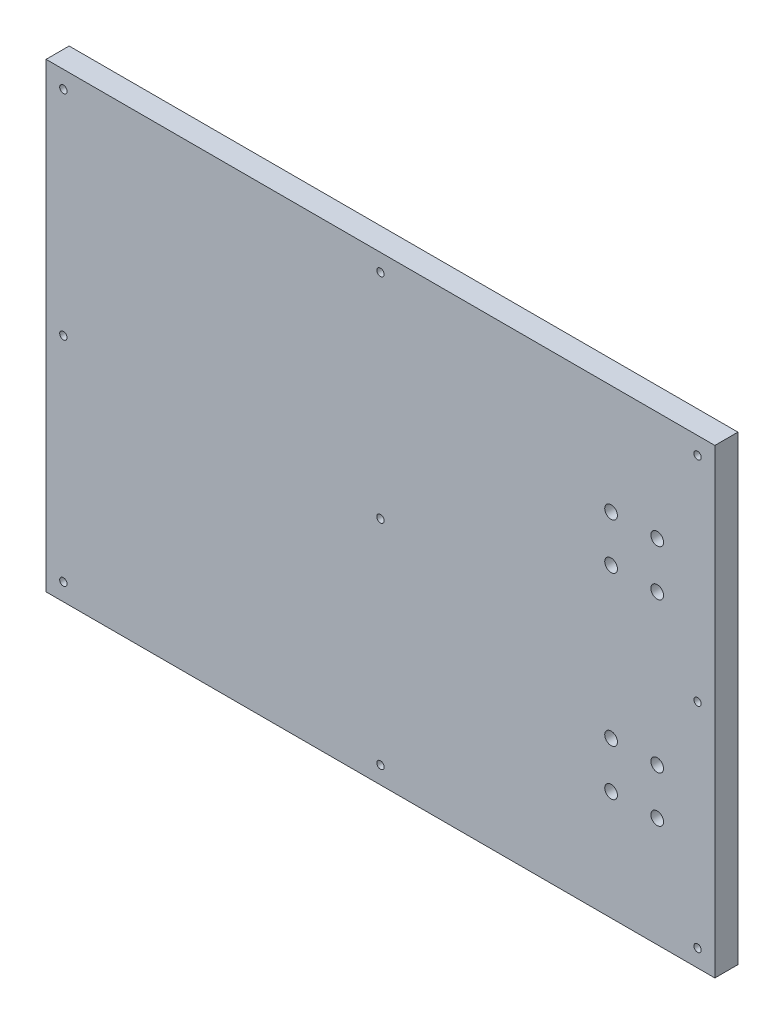
ISO-10303-21;
HEADER;
FILE_DESCRIPTION(('STEP AP214'),'2;1');
FILE_NAME('part.step','',(''),(''),'','','');
FILE_SCHEMA(('AUTOMOTIVE_DESIGN { 1 0 10303 214 1 1 1 1 }'));
ENDSEC;
DATA;
#1=APPLICATION_CONTEXT('core data for automotive mechanical design processes');
#2=APPLICATION_PROTOCOL_DEFINITION('international standard','automotive_design',2000,#1);
#3=PRODUCT_CONTEXT('',#1,'mechanical');
#4=PRODUCT('Part','Part','',(#3));
#5=PRODUCT_RELATED_PRODUCT_CATEGORY('part','',(#4));
#6=PRODUCT_DEFINITION_FORMATION('','',#4);
#7=PRODUCT_DEFINITION_CONTEXT('part definition',#1,'design');
#8=PRODUCT_DEFINITION('design','',#6,#7);
#9=PRODUCT_DEFINITION_SHAPE('','',#8);
#10=(LENGTH_UNIT() NAMED_UNIT(*) SI_UNIT(.MILLI.,.METRE.));
#11=(NAMED_UNIT(*) PLANE_ANGLE_UNIT() SI_UNIT($,.RADIAN.));
#12=(NAMED_UNIT(*) SI_UNIT($,.STERADIAN.) SOLID_ANGLE_UNIT());
#13=UNCERTAINTY_MEASURE_WITH_UNIT(LENGTH_MEASURE(1.E-05),#10,'distance_accuracy_value','');
#14=(GEOMETRIC_REPRESENTATION_CONTEXT(3) GLOBAL_UNCERTAINTY_ASSIGNED_CONTEXT((#13)) GLOBAL_UNIT_ASSIGNED_CONTEXT((#10,
#11,#12)) REPRESENTATION_CONTEXT('',''));
#15=CARTESIAN_POINT('',(0.,0.,0.));
#16=DIRECTION('',(0.,0.,1.));
#17=DIRECTION('',(1.,0.,0.));
#18=AXIS2_PLACEMENT_3D('',#15,#16,#17);
#19=CARTESIAN_POINT('',(0.,0.,10.));
#20=DIRECTION('',(0.,0.,1.));
#21=DIRECTION('',(1.,0.,0.));
#22=AXIS2_PLACEMENT_3D('',#19,#20,#21);
#23=PLANE('',#22);
#24=CARTESIAN_POINT('',(780.197027815795,179.96125611571,10.));
#25=DIRECTION('',(0.,0.,1.));
#26=DIRECTION('',(1.,0.,0.));
#27=AXIS2_PLACEMENT_3D('',#24,#25,#26);
#28=CIRCLE('',#27,1.60000000000005);
#29=CARTESIAN_POINT('',(781.797027815795,179.96125611571,10.));
#30=VERTEX_POINT('',#29);
#31=EDGE_CURVE('E201',#30,#30,#28,.T.);
#32=ORIENTED_EDGE('',*,*,#31,.F.);
#33=EDGE_LOOP('',(#32));
#34=FACE_BOUND('',#33,.T.);
#35=CARTESIAN_POINT('',(780.197027815795,364.961256115709,10.));
#36=DIRECTION('',(0.,0.,1.));
#37=DIRECTION('',(1.,0.,0.));
#38=AXIS2_PLACEMENT_3D('',#35,#36,#37);
#39=CIRCLE('',#38,1.60000000000005);
#40=CARTESIAN_POINT('',(781.797027815795,364.961256115709,10.));
#41=VERTEX_POINT('',#40);
#42=EDGE_CURVE('E189',#41,#41,#39,.T.);
#43=ORIENTED_EDGE('',*,*,#42,.F.);
#44=EDGE_LOOP('',(#43));
#45=FACE_BOUND('',#44,.T.);
#46=CARTESIAN_POINT('',(780.197027815795,272.461256115709,10.));
#47=DIRECTION('',(0.,0.,1.));
#48=DIRECTION('',(1.,0.,0.));
#49=AXIS2_PLACEMENT_3D('',#46,#47,#48);
#50=CIRCLE('',#49,1.60000000000005);
#51=CARTESIAN_POINT('',(781.797027815795,272.461256115709,10.));
#52=VERTEX_POINT('',#51);
#53=EDGE_CURVE('E177',#52,#52,#50,.T.);
#54=ORIENTED_EDGE('',*,*,#53,.F.);
#55=EDGE_LOOP('',(#54));
#56=FACE_BOUND('',#55,.T.);
#57=CARTESIAN_POINT('',(642.697027815795,179.96125611571,10.));
#58=DIRECTION('',(0.,0.,1.));
#59=DIRECTION('',(1.,0.,0.));
#60=AXIS2_PLACEMENT_3D('',#57,#58,#59);
#61=CIRCLE('',#60,1.60000000000005);
#62=CARTESIAN_POINT('',(644.297027815795,179.96125611571,10.));
#63=VERTEX_POINT('',#62);
#64=EDGE_CURVE('E165',#63,#63,#61,.T.);
#65=ORIENTED_EDGE('',*,*,#64,.F.);
#66=EDGE_LOOP('',(#65));
#67=FACE_BOUND('',#66,.T.);
#68=CARTESIAN_POINT('',(762.697027815795,304.96125611571,10.));
#69=DIRECTION('',(0.,0.,1.));
#70=DIRECTION('',(1.,0.,0.));
#71=AXIS2_PLACEMENT_3D('',#68,#69,#70);
#72=CIRCLE('',#71,2.75000000000003);
#73=CARTESIAN_POINT('',(765.447027815795,304.96125611571,10.));
#74=VERTEX_POINT('',#73);
#75=EDGE_CURVE('E153',#74,#74,#72,.T.);
#76=ORIENTED_EDGE('',*,*,#75,.F.);
#77=EDGE_LOOP('',(#76));
#78=FACE_BOUND('',#77,.T.);
#79=CARTESIAN_POINT('',(762.697027815795,324.96125611571,10.));
#80=DIRECTION('',(0.,0.,1.));
#81=DIRECTION('',(1.,0.,0.));
#82=AXIS2_PLACEMENT_3D('',#79,#80,#81);
#83=CIRCLE('',#82,2.75000000000003);
#84=CARTESIAN_POINT('',(765.447027815795,324.96125611571,10.));
#85=VERTEX_POINT('',#84);
#86=EDGE_CURVE('E141',#85,#85,#83,.T.);
#87=ORIENTED_EDGE('',*,*,#86,.F.);
#88=EDGE_LOOP('',(#87));
#89=FACE_BOUND('',#88,.T.);
#90=CARTESIAN_POINT('',(762.697027815795,239.96125611571,10.));
#91=DIRECTION('',(0.,0.,1.));
#92=DIRECTION('',(1.,0.,0.));
#93=AXIS2_PLACEMENT_3D('',#90,#91,#92);
#94=CIRCLE('',#93,2.75000000000003);
#95=CARTESIAN_POINT('',(765.447027815795,239.96125611571,10.));
#96=VERTEX_POINT('',#95);
#97=EDGE_CURVE('E129',#96,#96,#94,.T.);
#98=ORIENTED_EDGE('',*,*,#97,.F.);
#99=EDGE_LOOP('',(#98));
#100=FACE_BOUND('',#99,.T.);
#101=CARTESIAN_POINT('',(762.697027815795,219.96125611571,10.));
#102=DIRECTION('',(0.,0.,1.));
#103=DIRECTION('',(1.,0.,0.));
#104=AXIS2_PLACEMENT_3D('',#101,#102,#103);
#105=CIRCLE('',#104,2.75000000000003);
#106=CARTESIAN_POINT('',(765.447027815795,219.96125611571,10.));
#107=VERTEX_POINT('',#106);
#108=EDGE_CURVE('E117',#107,#107,#105,.T.);
#109=ORIENTED_EDGE('',*,*,#108,.F.);
#110=EDGE_LOOP('',(#109));
#111=FACE_BOUND('',#110,.T.);
#112=DIRECTION('',(0.,1.,0.));
#113=VECTOR('',#112,1.);
#114=CARTESIAN_POINT('',(787.697027815795,172.46125611571,10.));
#115=LINE('',#114,#113);
#116=CARTESIAN_POINT('',(787.697027815795,172.46125611571,10.));
#117=VERTEX_POINT('',#116);
#118=CARTESIAN_POINT('',(787.697027815795,372.461256115709,10.));
#119=VERTEX_POINT('',#118);
#120=EDGE_CURVE('E87',#117,#119,#115,.T.);
#121=ORIENTED_EDGE('',*,*,#120,.T.);
#122=DIRECTION('',(-1.,0.,0.));
#123=VECTOR('',#122,1.);
#124=CARTESIAN_POINT('',(787.697027815795,372.461256115709,10.));
#125=LINE('',#124,#123);
#126=CARTESIAN_POINT('',(497.697027815795,372.46125611571,10.));
#127=VERTEX_POINT('',#126);
#128=EDGE_CURVE('E82',#119,#127,#125,.T.);
#129=ORIENTED_EDGE('',*,*,#128,.T.);
#130=DIRECTION('',(0.,-1.,0.));
#131=VECTOR('',#130,1.);
#132=CARTESIAN_POINT('',(497.697027815795,172.46125611571,10.));
#133=LINE('',#132,#131);
#134=CARTESIAN_POINT('',(497.697027815795,172.46125611571,10.));
#135=VERTEX_POINT('',#134);
#136=EDGE_CURVE('E85',#127,#135,#133,.T.);
#137=ORIENTED_EDGE('',*,*,#136,.T.);
#138=DIRECTION('',(1.,0.,0.));
#139=VECTOR('',#138,1.);
#140=CARTESIAN_POINT('',(497.697027815795,172.46125611571,10.));
#141=LINE('',#140,#139);
#142=EDGE_CURVE('E52',#135,#117,#141,.T.);
#143=ORIENTED_EDGE('',*,*,#142,.T.);
#144=EDGE_LOOP('',(#121,#129,#137,#143));
#145=FACE_BOUND('',#144,.T.);
#146=CARTESIAN_POINT('',(742.697027815795,219.96125611571,10.));
#147=DIRECTION('',(0.,0.,1.));
#148=DIRECTION('',(1.,0.,0.));
#149=AXIS2_PLACEMENT_3D('',#146,#147,#148);
#150=CIRCLE('',#149,2.75000000000003);
#151=CARTESIAN_POINT('',(745.447027815795,219.96125611571,10.));
#152=VERTEX_POINT('',#151);
#153=EDGE_CURVE('E102',#152,#152,#150,.T.);
#154=ORIENTED_EDGE('',*,*,#153,.F.);
#155=EDGE_LOOP('',(#154));
#156=FACE_BOUND('',#155,.T.);
#157=CARTESIAN_POINT('',(742.697027815795,239.96125611571,10.));
#158=DIRECTION('',(0.,0.,1.));
#159=DIRECTION('',(1.,0.,0.));
#160=AXIS2_PLACEMENT_3D('',#157,#158,#159);
#161=CIRCLE('',#160,2.75000000000003);
#162=CARTESIAN_POINT('',(745.447027815795,239.96125611571,10.));
#163=VERTEX_POINT('',#162);
#164=EDGE_CURVE('E123',#163,#163,#161,.T.);
#165=ORIENTED_EDGE('',*,*,#164,.F.);
#166=EDGE_LOOP('',(#165));
#167=FACE_BOUND('',#166,.T.);
#168=CARTESIAN_POINT('',(742.697027815795,324.96125611571,10.));
#169=DIRECTION('',(0.,0.,1.));
#170=DIRECTION('',(1.,0.,0.));
#171=AXIS2_PLACEMENT_3D('',#168,#169,#170);
#172=CIRCLE('',#171,2.75000000000003);
#173=CARTESIAN_POINT('',(745.447027815795,324.96125611571,10.));
#174=VERTEX_POINT('',#173);
#175=EDGE_CURVE('E135',#174,#174,#172,.T.);
#176=ORIENTED_EDGE('',*,*,#175,.F.);
#177=EDGE_LOOP('',(#176));
#178=FACE_BOUND('',#177,.T.);
#179=CARTESIAN_POINT('',(742.697027815795,304.96125611571,10.));
#180=DIRECTION('',(0.,0.,1.));
#181=DIRECTION('',(1.,0.,0.));
#182=AXIS2_PLACEMENT_3D('',#179,#180,#181);
#183=CIRCLE('',#182,2.75000000000003);
#184=CARTESIAN_POINT('',(745.447027815795,304.96125611571,10.));
#185=VERTEX_POINT('',#184);
#186=EDGE_CURVE('E147',#185,#185,#183,.T.);
#187=ORIENTED_EDGE('',*,*,#186,.F.);
#188=EDGE_LOOP('',(#187));
#189=FACE_BOUND('',#188,.T.);
#190=CARTESIAN_POINT('',(642.697027815795,364.96125611571,10.));
#191=DIRECTION('',(0.,0.,1.));
#192=DIRECTION('',(1.,0.,0.));
#193=AXIS2_PLACEMENT_3D('',#190,#191,#192);
#194=CIRCLE('',#193,1.60000000000005);
#195=CARTESIAN_POINT('',(644.297027815795,364.96125611571,10.));
#196=VERTEX_POINT('',#195);
#197=EDGE_CURVE('E159',#196,#196,#194,.T.);
#198=ORIENTED_EDGE('',*,*,#197,.F.);
#199=EDGE_LOOP('',(#198));
#200=FACE_BOUND('',#199,.T.);
#201=CARTESIAN_POINT('',(505.197027815795,272.46125611571,10.));
#202=DIRECTION('',(0.,0.,1.));
#203=DIRECTION('',(1.,0.,0.));
#204=AXIS2_PLACEMENT_3D('',#201,#202,#203);
#205=CIRCLE('',#204,1.60000000000005);
#206=CARTESIAN_POINT('',(506.797027815795,272.46125611571,10.));
#207=VERTEX_POINT('',#206);
#208=EDGE_CURVE('E171',#207,#207,#205,.T.);
#209=ORIENTED_EDGE('',*,*,#208,.F.);
#210=EDGE_LOOP('',(#209));
#211=FACE_BOUND('',#210,.T.);
#212=CARTESIAN_POINT('',(642.697027815795,272.46125611571,10.));
#213=DIRECTION('',(0.,0.,1.));
#214=DIRECTION('',(1.,0.,0.));
#215=AXIS2_PLACEMENT_3D('',#212,#213,#214);
#216=CIRCLE('',#215,1.60000000000005);
#217=CARTESIAN_POINT('',(644.297027815795,272.46125611571,10.));
#218=VERTEX_POINT('',#217);
#219=EDGE_CURVE('E183',#218,#218,#216,.T.);
#220=ORIENTED_EDGE('',*,*,#219,.F.);
#221=EDGE_LOOP('',(#220));
#222=FACE_BOUND('',#221,.T.);
#223=CARTESIAN_POINT('',(505.197027815795,364.96125611571,10.));
#224=DIRECTION('',(0.,0.,1.));
#225=DIRECTION('',(1.,0.,0.));
#226=AXIS2_PLACEMENT_3D('',#223,#224,#225);
#227=CIRCLE('',#226,1.60000000000005);
#228=CARTESIAN_POINT('',(506.797027815795,364.96125611571,10.));
#229=VERTEX_POINT('',#228);
#230=EDGE_CURVE('E195',#229,#229,#227,.T.);
#231=ORIENTED_EDGE('',*,*,#230,.F.);
#232=EDGE_LOOP('',(#231));
#233=FACE_BOUND('',#232,.T.);
#234=CARTESIAN_POINT('',(505.197027815795,179.96125611571,10.));
#235=DIRECTION('',(0.,0.,1.));
#236=DIRECTION('',(1.,0.,0.));
#237=AXIS2_PLACEMENT_3D('',#234,#235,#236);
#238=CIRCLE('',#237,1.60000000000005);
#239=CARTESIAN_POINT('',(506.797027815795,179.96125611571,10.));
#240=VERTEX_POINT('',#239);
#241=EDGE_CURVE('E207',#240,#240,#238,.T.);
#242=ORIENTED_EDGE('',*,*,#241,.F.);
#243=EDGE_LOOP('',(#242));
#244=FACE_BOUND('',#243,.T.);
#245=ADVANCED_FACE('F35',(#34,#45,#56,#67,#78,#89,#100,#111,#145,#156,#167,#178,#189,#200,#211,
#222,#233,#244),#23,.T.);
#246=CARTESIAN_POINT('',(0.,0.,0.));
#247=DIRECTION('',(0.,0.,1.));
#248=DIRECTION('',(1.,0.,0.));
#249=AXIS2_PLACEMENT_3D('',#246,#247,#248);
#250=PLANE('',#249);
#251=DIRECTION('',(0.,1.,0.));
#252=VECTOR('',#251,1.);
#253=CARTESIAN_POINT('',(787.697027815795,172.46125611571,0.));
#254=LINE('',#253,#252);
#255=CARTESIAN_POINT('',(787.697027815795,172.46125611571,0.));
#256=VERTEX_POINT('',#255);
#257=CARTESIAN_POINT('',(787.697027815795,372.461256115709,0.));
#258=VERTEX_POINT('',#257);
#259=EDGE_CURVE('E99',#256,#258,#254,.T.);
#260=ORIENTED_EDGE('',*,*,#259,.F.);
#261=DIRECTION('',(1.,0.,0.));
#262=VECTOR('',#261,1.);
#263=CARTESIAN_POINT('',(497.697027815795,172.46125611571,0.));
#264=LINE('',#263,#262);
#265=CARTESIAN_POINT('',(497.697027815795,172.46125611571,0.));
#266=VERTEX_POINT('',#265);
#267=EDGE_CURVE('E75',#266,#256,#264,.T.);
#268=ORIENTED_EDGE('',*,*,#267,.F.);
#269=DIRECTION('',(0.,-1.,0.));
#270=VECTOR('',#269,1.);
#271=CARTESIAN_POINT('',(497.697027815795,172.46125611571,0.));
#272=LINE('',#271,#270);
#273=CARTESIAN_POINT('',(497.697027815795,372.46125611571,0.));
#274=VERTEX_POINT('',#273);
#275=EDGE_CURVE('E69',#274,#266,#272,.T.);
#276=ORIENTED_EDGE('',*,*,#275,.F.);
#277=DIRECTION('',(-1.,0.,0.));
#278=VECTOR('',#277,1.);
#279=CARTESIAN_POINT('',(787.697027815795,372.461256115709,0.));
#280=LINE('',#279,#278);
#281=EDGE_CURVE('E91',#258,#274,#280,.T.);
#282=ORIENTED_EDGE('',*,*,#281,.F.);
#283=EDGE_LOOP('',(#260,#268,#276,#282));
#284=FACE_BOUND('',#283,.T.);
#285=CARTESIAN_POINT('',(742.697027815795,219.96125611571,0.));
#286=DIRECTION('',(0.,0.,1.));
#287=DIRECTION('',(1.,0.,0.));
#288=AXIS2_PLACEMENT_3D('',#285,#286,#287);
#289=CIRCLE('',#288,2.75000000000003);
#290=CARTESIAN_POINT('',(745.447027815795,219.96125611571,0.));
#291=VERTEX_POINT('',#290);
#292=EDGE_CURVE('E114',#291,#291,#289,.T.);
#293=ORIENTED_EDGE('',*,*,#292,.T.);
#294=EDGE_LOOP('',(#293));
#295=FACE_BOUND('',#294,.T.);
#296=CARTESIAN_POINT('',(762.697027815795,219.96125611571,0.));
#297=DIRECTION('',(0.,0.,1.));
#298=DIRECTION('',(1.,0.,0.));
#299=AXIS2_PLACEMENT_3D('',#296,#297,#298);
#300=CIRCLE('',#299,2.75000000000003);
#301=CARTESIAN_POINT('',(765.447027815795,219.96125611571,0.));
#302=VERTEX_POINT('',#301);
#303=EDGE_CURVE('E120',#302,#302,#300,.T.);
#304=ORIENTED_EDGE('',*,*,#303,.T.);
#305=EDGE_LOOP('',(#304));
#306=FACE_BOUND('',#305,.T.);
#307=CARTESIAN_POINT('',(742.697027815795,239.96125611571,0.));
#308=DIRECTION('',(0.,0.,1.));
#309=DIRECTION('',(1.,0.,0.));
#310=AXIS2_PLACEMENT_3D('',#307,#308,#309);
#311=CIRCLE('',#310,2.75000000000003);
#312=CARTESIAN_POINT('',(745.447027815795,239.96125611571,0.));
#313=VERTEX_POINT('',#312);
#314=EDGE_CURVE('E126',#313,#313,#311,.T.);
#315=ORIENTED_EDGE('',*,*,#314,.T.);
#316=EDGE_LOOP('',(#315));
#317=FACE_BOUND('',#316,.T.);
#318=CARTESIAN_POINT('',(762.697027815795,239.96125611571,0.));
#319=DIRECTION('',(0.,0.,1.));
#320=DIRECTION('',(1.,0.,0.));
#321=AXIS2_PLACEMENT_3D('',#318,#319,#320);
#322=CIRCLE('',#321,2.75000000000003);
#323=CARTESIAN_POINT('',(765.447027815795,239.96125611571,0.));
#324=VERTEX_POINT('',#323);
#325=EDGE_CURVE('E132',#324,#324,#322,.T.);
#326=ORIENTED_EDGE('',*,*,#325,.T.);
#327=EDGE_LOOP('',(#326));
#328=FACE_BOUND('',#327,.T.);
#329=CARTESIAN_POINT('',(742.697027815795,324.96125611571,0.));
#330=DIRECTION('',(0.,0.,1.));
#331=DIRECTION('',(1.,0.,0.));
#332=AXIS2_PLACEMENT_3D('',#329,#330,#331);
#333=CIRCLE('',#332,2.75000000000003);
#334=CARTESIAN_POINT('',(745.447027815795,324.96125611571,0.));
#335=VERTEX_POINT('',#334);
#336=EDGE_CURVE('E138',#335,#335,#333,.T.);
#337=ORIENTED_EDGE('',*,*,#336,.T.);
#338=EDGE_LOOP('',(#337));
#339=FACE_BOUND('',#338,.T.);
#340=CARTESIAN_POINT('',(762.697027815795,324.96125611571,0.));
#341=DIRECTION('',(0.,0.,1.));
#342=DIRECTION('',(1.,0.,0.));
#343=AXIS2_PLACEMENT_3D('',#340,#341,#342);
#344=CIRCLE('',#343,2.75000000000003);
#345=CARTESIAN_POINT('',(765.447027815795,324.96125611571,0.));
#346=VERTEX_POINT('',#345);
#347=EDGE_CURVE('E144',#346,#346,#344,.T.);
#348=ORIENTED_EDGE('',*,*,#347,.T.);
#349=EDGE_LOOP('',(#348));
#350=FACE_BOUND('',#349,.T.);
#351=CARTESIAN_POINT('',(742.697027815795,304.96125611571,0.));
#352=DIRECTION('',(0.,0.,1.));
#353=DIRECTION('',(1.,0.,0.));
#354=AXIS2_PLACEMENT_3D('',#351,#352,#353);
#355=CIRCLE('',#354,2.75000000000003);
#356=CARTESIAN_POINT('',(745.447027815795,304.96125611571,0.));
#357=VERTEX_POINT('',#356);
#358=EDGE_CURVE('E150',#357,#357,#355,.T.);
#359=ORIENTED_EDGE('',*,*,#358,.T.);
#360=EDGE_LOOP('',(#359));
#361=FACE_BOUND('',#360,.T.);
#362=CARTESIAN_POINT('',(762.697027815795,304.96125611571,0.));
#363=DIRECTION('',(0.,0.,1.));
#364=DIRECTION('',(1.,0.,0.));
#365=AXIS2_PLACEMENT_3D('',#362,#363,#364);
#366=CIRCLE('',#365,2.75000000000003);
#367=CARTESIAN_POINT('',(765.447027815795,304.96125611571,0.));
#368=VERTEX_POINT('',#367);
#369=EDGE_CURVE('E156',#368,#368,#366,.T.);
#370=ORIENTED_EDGE('',*,*,#369,.T.);
#371=EDGE_LOOP('',(#370));
#372=FACE_BOUND('',#371,.T.);
#373=CARTESIAN_POINT('',(642.697027815795,364.96125611571,0.));
#374=DIRECTION('',(0.,0.,1.));
#375=DIRECTION('',(1.,0.,0.));
#376=AXIS2_PLACEMENT_3D('',#373,#374,#375);
#377=CIRCLE('',#376,1.60000000000005);
#378=CARTESIAN_POINT('',(644.297027815795,364.96125611571,0.));
#379=VERTEX_POINT('',#378);
#380=EDGE_CURVE('E162',#379,#379,#377,.T.);
#381=ORIENTED_EDGE('',*,*,#380,.T.);
#382=EDGE_LOOP('',(#381));
#383=FACE_BOUND('',#382,.T.);
#384=CARTESIAN_POINT('',(642.697027815795,179.96125611571,0.));
#385=DIRECTION('',(0.,0.,1.));
#386=DIRECTION('',(1.,0.,0.));
#387=AXIS2_PLACEMENT_3D('',#384,#385,#386);
#388=CIRCLE('',#387,1.60000000000005);
#389=CARTESIAN_POINT('',(644.297027815795,179.96125611571,0.));
#390=VERTEX_POINT('',#389);
#391=EDGE_CURVE('E168',#390,#390,#388,.T.);
#392=ORIENTED_EDGE('',*,*,#391,.T.);
#393=EDGE_LOOP('',(#392));
#394=FACE_BOUND('',#393,.T.);
#395=CARTESIAN_POINT('',(505.197027815795,272.46125611571,0.));
#396=DIRECTION('',(0.,0.,1.));
#397=DIRECTION('',(1.,0.,0.));
#398=AXIS2_PLACEMENT_3D('',#395,#396,#397);
#399=CIRCLE('',#398,1.60000000000005);
#400=CARTESIAN_POINT('',(506.797027815795,272.46125611571,0.));
#401=VERTEX_POINT('',#400);
#402=EDGE_CURVE('E174',#401,#401,#399,.T.);
#403=ORIENTED_EDGE('',*,*,#402,.T.);
#404=EDGE_LOOP('',(#403));
#405=FACE_BOUND('',#404,.T.);
#406=CARTESIAN_POINT('',(780.197027815795,272.461256115709,0.));
#407=DIRECTION('',(0.,0.,1.));
#408=DIRECTION('',(1.,0.,0.));
#409=AXIS2_PLACEMENT_3D('',#406,#407,#408);
#410=CIRCLE('',#409,1.60000000000005);
#411=CARTESIAN_POINT('',(781.797027815795,272.461256115709,0.));
#412=VERTEX_POINT('',#411);
#413=EDGE_CURVE('E180',#412,#412,#410,.T.);
#414=ORIENTED_EDGE('',*,*,#413,.T.);
#415=EDGE_LOOP('',(#414));
#416=FACE_BOUND('',#415,.T.);
#417=CARTESIAN_POINT('',(642.697027815795,272.46125611571,0.));
#418=DIRECTION('',(0.,0.,1.));
#419=DIRECTION('',(1.,0.,0.));
#420=AXIS2_PLACEMENT_3D('',#417,#418,#419);
#421=CIRCLE('',#420,1.60000000000005);
#422=CARTESIAN_POINT('',(644.297027815795,272.46125611571,0.));
#423=VERTEX_POINT('',#422);
#424=EDGE_CURVE('E186',#423,#423,#421,.T.);
#425=ORIENTED_EDGE('',*,*,#424,.T.);
#426=EDGE_LOOP('',(#425));
#427=FACE_BOUND('',#426,.T.);
#428=CARTESIAN_POINT('',(780.197027815795,364.961256115709,0.));
#429=DIRECTION('',(0.,0.,1.));
#430=DIRECTION('',(1.,0.,0.));
#431=AXIS2_PLACEMENT_3D('',#428,#429,#430);
#432=CIRCLE('',#431,1.60000000000005);
#433=CARTESIAN_POINT('',(781.797027815795,364.961256115709,0.));
#434=VERTEX_POINT('',#433);
#435=EDGE_CURVE('E192',#434,#434,#432,.T.);
#436=ORIENTED_EDGE('',*,*,#435,.T.);
#437=EDGE_LOOP('',(#436));
#438=FACE_BOUND('',#437,.T.);
#439=CARTESIAN_POINT('',(505.197027815795,364.96125611571,0.));
#440=DIRECTION('',(0.,0.,1.));
#441=DIRECTION('',(1.,0.,0.));
#442=AXIS2_PLACEMENT_3D('',#439,#440,#441);
#443=CIRCLE('',#442,1.60000000000005);
#444=CARTESIAN_POINT('',(506.797027815795,364.96125611571,0.));
#445=VERTEX_POINT('',#444);
#446=EDGE_CURVE('E198',#445,#445,#443,.T.);
#447=ORIENTED_EDGE('',*,*,#446,.T.);
#448=EDGE_LOOP('',(#447));
#449=FACE_BOUND('',#448,.T.);
#450=CARTESIAN_POINT('',(780.197027815795,179.96125611571,0.));
#451=DIRECTION('',(0.,0.,1.));
#452=DIRECTION('',(1.,0.,0.));
#453=AXIS2_PLACEMENT_3D('',#450,#451,#452);
#454=CIRCLE('',#453,1.60000000000005);
#455=CARTESIAN_POINT('',(781.797027815795,179.96125611571,0.));
#456=VERTEX_POINT('',#455);
#457=EDGE_CURVE('E204',#456,#456,#454,.T.);
#458=ORIENTED_EDGE('',*,*,#457,.T.);
#459=EDGE_LOOP('',(#458));
#460=FACE_BOUND('',#459,.T.);
#461=CARTESIAN_POINT('',(505.197027815795,179.96125611571,0.));
#462=DIRECTION('',(0.,0.,1.));
#463=DIRECTION('',(1.,0.,0.));
#464=AXIS2_PLACEMENT_3D('',#461,#462,#463);
#465=CIRCLE('',#464,1.60000000000005);
#466=CARTESIAN_POINT('',(506.797027815795,179.96125611571,0.));
#467=VERTEX_POINT('',#466);
#468=EDGE_CURVE('E210',#467,#467,#465,.T.);
#469=ORIENTED_EDGE('',*,*,#468,.T.);
#470=EDGE_LOOP('',(#469));
#471=FACE_BOUND('',#470,.T.);
#472=ADVANCED_FACE('F110',(#284,#295,#306,#317,#328,#339,#350,#361,#372,#383,#394,#405,#416,
#427,#438,#449,#460,#471),#250,.F.);
#473=CARTESIAN_POINT('',(787.697027815795,172.46125611571,10.));
#474=DIRECTION('',(-1.,0.,0.));
#475=DIRECTION('',(0.,-1.,0.));
#476=AXIS2_PLACEMENT_3D('',#473,#474,#475);
#477=PLANE('',#476);
#478=ORIENTED_EDGE('',*,*,#259,.T.);
#479=DIRECTION('',(0.,0.,-1.));
#480=VECTOR('',#479,1.);
#481=CARTESIAN_POINT('',(787.697027815795,372.461256115709,10.));
#482=LINE('',#481,#480);
#483=EDGE_CURVE('E11',#119,#258,#482,.T.);
#484=ORIENTED_EDGE('',*,*,#483,.F.);
#485=ORIENTED_EDGE('',*,*,#120,.F.);
#486=DIRECTION('',(0.,0.,-1.));
#487=VECTOR('',#486,1.);
#488=CARTESIAN_POINT('',(787.697027815795,172.46125611571,10.));
#489=LINE('',#488,#487);
#490=EDGE_CURVE('E95',#117,#256,#489,.T.);
#491=ORIENTED_EDGE('',*,*,#490,.T.);
#492=EDGE_LOOP('',(#478,#484,#485,#491));
#493=FACE_BOUND('',#492,.T.);
#494=ADVANCED_FACE('F37',(#493),#477,.F.);
#495=CARTESIAN_POINT('',(787.697027815795,372.461256115709,10.));
#496=DIRECTION('',(0.,-1.,0.));
#497=DIRECTION('',(1.,0.,0.));
#498=AXIS2_PLACEMENT_3D('',#495,#496,#497);
#499=PLANE('',#498);
#500=ORIENTED_EDGE('',*,*,#281,.T.);
#501=DIRECTION('',(0.,0.,-1.));
#502=VECTOR('',#501,1.);
#503=CARTESIAN_POINT('',(497.697027815795,372.46125611571,10.));
#504=LINE('',#503,#502);
#505=EDGE_CURVE('E44',#127,#274,#504,.T.);
#506=ORIENTED_EDGE('',*,*,#505,.F.);
#507=ORIENTED_EDGE('',*,*,#128,.F.);
#508=ORIENTED_EDGE('',*,*,#483,.T.);
#509=EDGE_LOOP('',(#500,#506,#507,#508));
#510=FACE_BOUND('',#509,.T.);
#511=ADVANCED_FACE('F90',(#510),#499,.F.);
#512=CARTESIAN_POINT('',(497.697027815795,172.46125611571,10.));
#513=DIRECTION('',(1.,0.,0.));
#514=DIRECTION('',(0.,1.,0.));
#515=AXIS2_PLACEMENT_3D('',#512,#513,#514);
#516=PLANE('',#515);
#517=ORIENTED_EDGE('',*,*,#275,.T.);
#518=DIRECTION('',(0.,0.,-1.));
#519=VECTOR('',#518,1.);
#520=CARTESIAN_POINT('',(497.697027815795,172.46125611571,10.));
#521=LINE('',#520,#519);
#522=EDGE_CURVE('E92',#135,#266,#521,.T.);
#523=ORIENTED_EDGE('',*,*,#522,.F.);
#524=ORIENTED_EDGE('',*,*,#136,.F.);
#525=ORIENTED_EDGE('',*,*,#505,.T.);
#526=EDGE_LOOP('',(#517,#523,#524,#525));
#527=FACE_BOUND('',#526,.T.);
#528=ADVANCED_FACE('F93',(#527),#516,.F.);
#529=CARTESIAN_POINT('',(497.697027815795,172.46125611571,10.));
#530=DIRECTION('',(0.,1.,0.));
#531=DIRECTION('',(-1.,0.,0.));
#532=AXIS2_PLACEMENT_3D('',#529,#530,#531);
#533=PLANE('',#532);
#534=ORIENTED_EDGE('',*,*,#267,.T.);
#535=ORIENTED_EDGE('',*,*,#490,.F.);
#536=ORIENTED_EDGE('',*,*,#142,.F.);
#537=ORIENTED_EDGE('',*,*,#522,.T.);
#538=EDGE_LOOP('',(#534,#535,#536,#537));
#539=FACE_BOUND('',#538,.T.);
#540=ADVANCED_FACE('F107',(#539),#533,.F.);
#541=CARTESIAN_POINT('',(742.697027815795,219.96125611571,10.));
#542=DIRECTION('',(0.,0.,-1.));
#543=DIRECTION('',(-1.,0.,0.));
#544=AXIS2_PLACEMENT_3D('',#541,#542,#543);
#545=CYLINDRICAL_SURFACE('',#544,2.75000000000003);
#546=ORIENTED_EDGE('',*,*,#153,.T.);
#547=EDGE_LOOP('',(#546));
#548=FACE_BOUND('',#547,.T.);
#549=ORIENTED_EDGE('',*,*,#292,.F.);
#550=EDGE_LOOP('',(#549));
#551=FACE_BOUND('',#550,.T.);
#552=ADVANCED_FACE('F229',(#548,#551),#545,.F.);
#553=CARTESIAN_POINT('',(762.697027815795,219.96125611571,10.));
#554=DIRECTION('',(0.,0.,-1.));
#555=DIRECTION('',(-1.,0.,0.));
#556=AXIS2_PLACEMENT_3D('',#553,#554,#555);
#557=CYLINDRICAL_SURFACE('',#556,2.75000000000003);
#558=ORIENTED_EDGE('',*,*,#108,.T.);
#559=EDGE_LOOP('',(#558));
#560=FACE_BOUND('',#559,.T.);
#561=ORIENTED_EDGE('',*,*,#303,.F.);
#562=EDGE_LOOP('',(#561));
#563=FACE_BOUND('',#562,.T.);
#564=ADVANCED_FACE('F275',(#560,#563),#557,.F.);
#565=CARTESIAN_POINT('',(742.697027815795,239.96125611571,10.));
#566=DIRECTION('',(0.,0.,-1.));
#567=DIRECTION('',(-1.,0.,0.));
#568=AXIS2_PLACEMENT_3D('',#565,#566,#567);
#569=CYLINDRICAL_SURFACE('',#568,2.75000000000003);
#570=ORIENTED_EDGE('',*,*,#164,.T.);
#571=EDGE_LOOP('',(#570));
#572=FACE_BOUND('',#571,.T.);
#573=ORIENTED_EDGE('',*,*,#314,.F.);
#574=EDGE_LOOP('',(#573));
#575=FACE_BOUND('',#574,.T.);
#576=ADVANCED_FACE('F283',(#572,#575),#569,.F.);
#577=CARTESIAN_POINT('',(762.697027815795,239.96125611571,10.));
#578=DIRECTION('',(0.,0.,-1.));
#579=DIRECTION('',(-1.,0.,0.));
#580=AXIS2_PLACEMENT_3D('',#577,#578,#579);
#581=CYLINDRICAL_SURFACE('',#580,2.75000000000003);
#582=ORIENTED_EDGE('',*,*,#97,.T.);
#583=EDGE_LOOP('',(#582));
#584=FACE_BOUND('',#583,.T.);
#585=ORIENTED_EDGE('',*,*,#325,.F.);
#586=EDGE_LOOP('',(#585));
#587=FACE_BOUND('',#586,.T.);
#588=ADVANCED_FACE('F291',(#584,#587),#581,.F.);
#589=CARTESIAN_POINT('',(742.697027815795,324.96125611571,10.));
#590=DIRECTION('',(0.,0.,-1.));
#591=DIRECTION('',(-1.,0.,0.));
#592=AXIS2_PLACEMENT_3D('',#589,#590,#591);
#593=CYLINDRICAL_SURFACE('',#592,2.75000000000003);
#594=ORIENTED_EDGE('',*,*,#175,.T.);
#595=EDGE_LOOP('',(#594));
#596=FACE_BOUND('',#595,.T.);
#597=ORIENTED_EDGE('',*,*,#336,.F.);
#598=EDGE_LOOP('',(#597));
#599=FACE_BOUND('',#598,.T.);
#600=ADVANCED_FACE('F300',(#596,#599),#593,.F.);
#601=CARTESIAN_POINT('',(762.697027815795,324.96125611571,10.));
#602=DIRECTION('',(0.,0.,-1.));
#603=DIRECTION('',(-1.,0.,0.));
#604=AXIS2_PLACEMENT_3D('',#601,#602,#603);
#605=CYLINDRICAL_SURFACE('',#604,2.75000000000003);
#606=ORIENTED_EDGE('',*,*,#86,.T.);
#607=EDGE_LOOP('',(#606));
#608=FACE_BOUND('',#607,.T.);
#609=ORIENTED_EDGE('',*,*,#347,.F.);
#610=EDGE_LOOP('',(#609));
#611=FACE_BOUND('',#610,.T.);
#612=ADVANCED_FACE('F309',(#608,#611),#605,.F.);
#613=CARTESIAN_POINT('',(742.697027815795,304.96125611571,10.));
#614=DIRECTION('',(0.,0.,-1.));
#615=DIRECTION('',(-1.,0.,0.));
#616=AXIS2_PLACEMENT_3D('',#613,#614,#615);
#617=CYLINDRICAL_SURFACE('',#616,2.75000000000003);
#618=ORIENTED_EDGE('',*,*,#186,.T.);
#619=EDGE_LOOP('',(#618));
#620=FACE_BOUND('',#619,.T.);
#621=ORIENTED_EDGE('',*,*,#358,.F.);
#622=EDGE_LOOP('',(#621));
#623=FACE_BOUND('',#622,.T.);
#624=ADVANCED_FACE('F318',(#620,#623),#617,.F.);
#625=CARTESIAN_POINT('',(762.697027815795,304.96125611571,10.));
#626=DIRECTION('',(0.,0.,-1.));
#627=DIRECTION('',(-1.,0.,0.));
#628=AXIS2_PLACEMENT_3D('',#625,#626,#627);
#629=CYLINDRICAL_SURFACE('',#628,2.75000000000003);
#630=ORIENTED_EDGE('',*,*,#75,.T.);
#631=EDGE_LOOP('',(#630));
#632=FACE_BOUND('',#631,.T.);
#633=ORIENTED_EDGE('',*,*,#369,.F.);
#634=EDGE_LOOP('',(#633));
#635=FACE_BOUND('',#634,.T.);
#636=ADVANCED_FACE('F327',(#632,#635),#629,.F.);
#637=CARTESIAN_POINT('',(642.697027815795,364.96125611571,10.));
#638=DIRECTION('',(0.,0.,-1.));
#639=DIRECTION('',(-1.,0.,0.));
#640=AXIS2_PLACEMENT_3D('',#637,#638,#639);
#641=CYLINDRICAL_SURFACE('',#640,1.60000000000005);
#642=ORIENTED_EDGE('',*,*,#197,.T.);
#643=EDGE_LOOP('',(#642));
#644=FACE_BOUND('',#643,.T.);
#645=ORIENTED_EDGE('',*,*,#380,.F.);
#646=EDGE_LOOP('',(#645));
#647=FACE_BOUND('',#646,.T.);
#648=ADVANCED_FACE('F336',(#644,#647),#641,.F.);
#649=CARTESIAN_POINT('',(642.697027815795,179.96125611571,10.));
#650=DIRECTION('',(0.,0.,-1.));
#651=DIRECTION('',(-1.,0.,0.));
#652=AXIS2_PLACEMENT_3D('',#649,#650,#651);
#653=CYLINDRICAL_SURFACE('',#652,1.60000000000005);
#654=ORIENTED_EDGE('',*,*,#64,.T.);
#655=EDGE_LOOP('',(#654));
#656=FACE_BOUND('',#655,.T.);
#657=ORIENTED_EDGE('',*,*,#391,.F.);
#658=EDGE_LOOP('',(#657));
#659=FACE_BOUND('',#658,.T.);
#660=ADVANCED_FACE('F345',(#656,#659),#653,.F.);
#661=CARTESIAN_POINT('',(505.197027815795,272.46125611571,10.));
#662=DIRECTION('',(0.,0.,-1.));
#663=DIRECTION('',(-1.,0.,0.));
#664=AXIS2_PLACEMENT_3D('',#661,#662,#663);
#665=CYLINDRICAL_SURFACE('',#664,1.60000000000005);
#666=ORIENTED_EDGE('',*,*,#208,.T.);
#667=EDGE_LOOP('',(#666));
#668=FACE_BOUND('',#667,.T.);
#669=ORIENTED_EDGE('',*,*,#402,.F.);
#670=EDGE_LOOP('',(#669));
#671=FACE_BOUND('',#670,.T.);
#672=ADVANCED_FACE('F354',(#668,#671),#665,.F.);
#673=CARTESIAN_POINT('',(780.197027815795,272.461256115709,10.));
#674=DIRECTION('',(0.,0.,-1.));
#675=DIRECTION('',(-1.,0.,0.));
#676=AXIS2_PLACEMENT_3D('',#673,#674,#675);
#677=CYLINDRICAL_SURFACE('',#676,1.60000000000005);
#678=ORIENTED_EDGE('',*,*,#53,.T.);
#679=EDGE_LOOP('',(#678));
#680=FACE_BOUND('',#679,.T.);
#681=ORIENTED_EDGE('',*,*,#413,.F.);
#682=EDGE_LOOP('',(#681));
#683=FACE_BOUND('',#682,.T.);
#684=ADVANCED_FACE('F363',(#680,#683),#677,.F.);
#685=CARTESIAN_POINT('',(642.697027815795,272.46125611571,10.));
#686=DIRECTION('',(0.,0.,-1.));
#687=DIRECTION('',(-1.,0.,0.));
#688=AXIS2_PLACEMENT_3D('',#685,#686,#687);
#689=CYLINDRICAL_SURFACE('',#688,1.60000000000005);
#690=ORIENTED_EDGE('',*,*,#219,.T.);
#691=EDGE_LOOP('',(#690));
#692=FACE_BOUND('',#691,.T.);
#693=ORIENTED_EDGE('',*,*,#424,.F.);
#694=EDGE_LOOP('',(#693));
#695=FACE_BOUND('',#694,.T.);
#696=ADVANCED_FACE('F372',(#692,#695),#689,.F.);
#697=CARTESIAN_POINT('',(780.197027815795,364.961256115709,10.));
#698=DIRECTION('',(0.,0.,-1.));
#699=DIRECTION('',(-1.,0.,0.));
#700=AXIS2_PLACEMENT_3D('',#697,#698,#699);
#701=CYLINDRICAL_SURFACE('',#700,1.60000000000005);
#702=ORIENTED_EDGE('',*,*,#42,.T.);
#703=EDGE_LOOP('',(#702));
#704=FACE_BOUND('',#703,.T.);
#705=ORIENTED_EDGE('',*,*,#435,.F.);
#706=EDGE_LOOP('',(#705));
#707=FACE_BOUND('',#706,.T.);
#708=ADVANCED_FACE('F381',(#704,#707),#701,.F.);
#709=CARTESIAN_POINT('',(505.197027815795,364.96125611571,10.));
#710=DIRECTION('',(0.,0.,-1.));
#711=DIRECTION('',(-1.,0.,0.));
#712=AXIS2_PLACEMENT_3D('',#709,#710,#711);
#713=CYLINDRICAL_SURFACE('',#712,1.60000000000005);
#714=ORIENTED_EDGE('',*,*,#230,.T.);
#715=EDGE_LOOP('',(#714));
#716=FACE_BOUND('',#715,.T.);
#717=ORIENTED_EDGE('',*,*,#446,.F.);
#718=EDGE_LOOP('',(#717));
#719=FACE_BOUND('',#718,.T.);
#720=ADVANCED_FACE('F390',(#716,#719),#713,.F.);
#721=CARTESIAN_POINT('',(780.197027815795,179.96125611571,10.));
#722=DIRECTION('',(0.,0.,-1.));
#723=DIRECTION('',(-1.,0.,0.));
#724=AXIS2_PLACEMENT_3D('',#721,#722,#723);
#725=CYLINDRICAL_SURFACE('',#724,1.60000000000005);
#726=ORIENTED_EDGE('',*,*,#31,.T.);
#727=EDGE_LOOP('',(#726));
#728=FACE_BOUND('',#727,.T.);
#729=ORIENTED_EDGE('',*,*,#457,.F.);
#730=EDGE_LOOP('',(#729));
#731=FACE_BOUND('',#730,.T.);
#732=ADVANCED_FACE('F399',(#728,#731),#725,.F.);
#733=CARTESIAN_POINT('',(505.197027815795,179.96125611571,10.));
#734=DIRECTION('',(0.,0.,-1.));
#735=DIRECTION('',(-1.,0.,0.));
#736=AXIS2_PLACEMENT_3D('',#733,#734,#735);
#737=CYLINDRICAL_SURFACE('',#736,1.60000000000005);
#738=ORIENTED_EDGE('',*,*,#241,.T.);
#739=EDGE_LOOP('',(#738));
#740=FACE_BOUND('',#739,.T.);
#741=ORIENTED_EDGE('',*,*,#468,.F.);
#742=EDGE_LOOP('',(#741));
#743=FACE_BOUND('',#742,.T.);
#744=ADVANCED_FACE('F216',(#740,#743),#737,.F.);
#745=CLOSED_SHELL('',(#245,#472,#494,#511,#528,#540,#552,#564,#576,#588,#600,#612,#624,#636,
#648,#660,#672,#684,#696,#708,#720,#732,#744));
#746=MANIFOLD_SOLID_BREP('B2',#745);
#747=ADVANCED_BREP_SHAPE_REPRESENTATION('',(#18,#746),#14);
#748=SHAPE_DEFINITION_REPRESENTATION(#9,#747);
ENDSEC;
END-ISO-10303-21;
